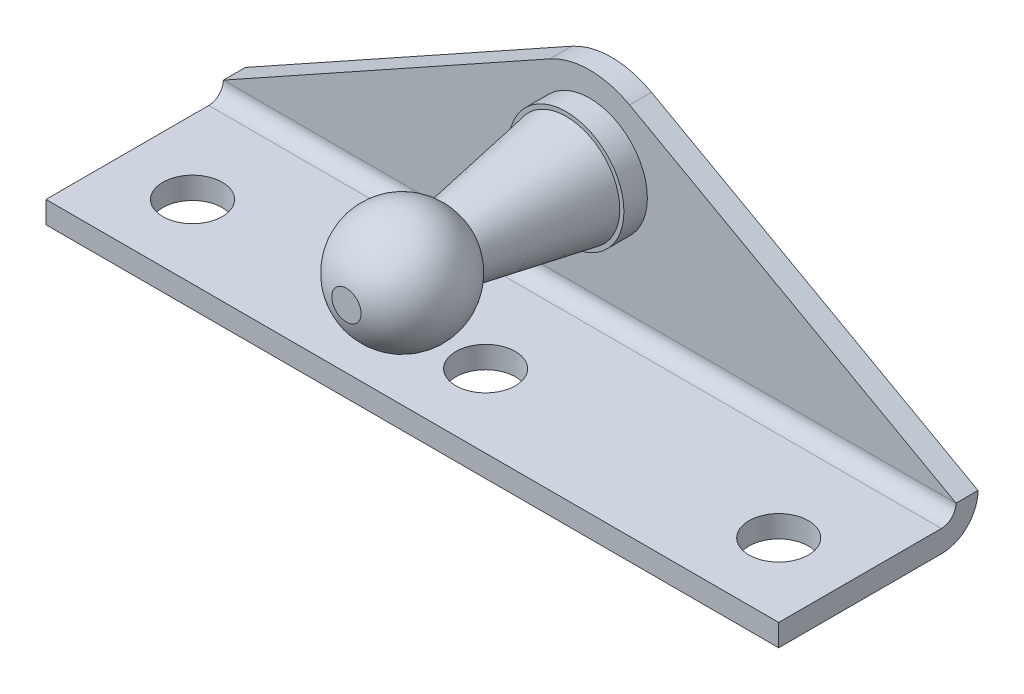
ISO-10303-21;
HEADER;
FILE_DESCRIPTION(('STEP AP214'),'2;1');
FILE_NAME('part.step','',(''),(''),'','','');
FILE_SCHEMA(('AUTOMOTIVE_DESIGN { 1 0 10303 214 1 1 1 1 }'));
ENDSEC;
DATA;
#1=APPLICATION_CONTEXT('core data for automotive mechanical design processes');
#2=APPLICATION_PROTOCOL_DEFINITION('international standard','automotive_design',2000,#1);
#3=PRODUCT_CONTEXT('',#1,'mechanical');
#4=PRODUCT('Part','Part','',(#3));
#5=PRODUCT_RELATED_PRODUCT_CATEGORY('part','',(#4));
#6=PRODUCT_DEFINITION_FORMATION('','',#4);
#7=PRODUCT_DEFINITION_CONTEXT('part definition',#1,'design');
#8=PRODUCT_DEFINITION('design','',#6,#7);
#9=PRODUCT_DEFINITION_SHAPE('','',#8);
#10=(LENGTH_UNIT() NAMED_UNIT(*) SI_UNIT(.MILLI.,.METRE.));
#11=(NAMED_UNIT(*) PLANE_ANGLE_UNIT() SI_UNIT($,.RADIAN.));
#12=(NAMED_UNIT(*) SI_UNIT($,.STERADIAN.) SOLID_ANGLE_UNIT());
#13=UNCERTAINTY_MEASURE_WITH_UNIT(LENGTH_MEASURE(1.E-05),#10,'distance_accuracy_value','');
#14=(GEOMETRIC_REPRESENTATION_CONTEXT(3) GLOBAL_UNCERTAINTY_ASSIGNED_CONTEXT((#13)) GLOBAL_UNIT_ASSIGNED_CONTEXT((#10,
#11,#12)) REPRESENTATION_CONTEXT('',''));
#15=CARTESIAN_POINT('',(0.,0.,0.));
#16=DIRECTION('',(0.,0.,1.));
#17=DIRECTION('',(1.,0.,0.));
#18=AXIS2_PLACEMENT_3D('',#15,#16,#17);
#19=CARTESIAN_POINT('',(0.,0.,1.905));
#20=DIRECTION('',(0.,0.,1.));
#21=DIRECTION('',(1.,0.,0.));
#22=AXIS2_PLACEMENT_3D('',#19,#20,#21);
#23=PLANE('',#22);
#24=DIRECTION('',(-0.873869365108266,-0.48616080953248,0.));
#25=VECTOR('',#24,1.);
#26=CARTESIAN_POINT('',(-3.457575677395,6.21495892464998,1.905));
#27=LINE('',#26,#25);
#28=CARTESIAN_POINT('',(-3.457575677395,6.21495892464998,1.905));
#29=VERTEX_POINT('',#28);
#30=CARTESIAN_POINT('',(-31.75,-9.525,1.905));
#31=VERTEX_POINT('',#30);
#32=EDGE_CURVE('E137',#29,#31,#27,.T.);
#33=ORIENTED_EDGE('',*,*,#32,.T.);
#34=DIRECTION('',(1.,0.,0.));
#35=VECTOR('',#34,1.);
#36=CARTESIAN_POINT('',(0.,-9.525,1.905));
#37=LINE('',#36,#35);
#38=CARTESIAN_POINT('',(31.75,-9.52499999999999,1.905));
#39=VERTEX_POINT('',#38);
#40=EDGE_CURVE('E160',#31,#39,#37,.T.);
#41=ORIENTED_EDGE('',*,*,#40,.T.);
#42=DIRECTION('',(-0.873869365108266,0.48616080953248,0.));
#43=VECTOR('',#42,1.);
#44=CARTESIAN_POINT('',(31.75,-9.52499999999999,1.905));
#45=LINE('',#44,#43);
#46=CARTESIAN_POINT('',(3.457575677395,6.21495892464998,1.905));
#47=VERTEX_POINT('',#46);
#48=EDGE_CURVE('E132',#39,#47,#45,.T.);
#49=ORIENTED_EDGE('',*,*,#48,.T.);
#50=CARTESIAN_POINT('',(0.,0.,1.905));
#51=DIRECTION('',(0.,0.,1.));
#52=DIRECTION('',(1.,0.,0.));
#53=AXIS2_PLACEMENT_3D('',#50,#51,#52);
#54=CIRCLE('',#53,7.112);
#55=EDGE_CURVE('E134',#47,#29,#54,.T.);
#56=ORIENTED_EDGE('',*,*,#55,.T.);
#57=EDGE_LOOP('',(#33,#41,#49,#56));
#58=FACE_BOUND('',#57,.T.);
#59=CARTESIAN_POINT('',(0.,0.,1.905));
#60=DIRECTION('',(0.,0.,1.));
#61=DIRECTION('',(1.,0.,0.));
#62=AXIS2_PLACEMENT_3D('',#59,#60,#61);
#63=CIRCLE('',#62,5.);
#64=CARTESIAN_POINT('',(5.,0.,1.905));
#65=VERTEX_POINT('',#64);
#66=EDGE_CURVE('E407',#65,#65,#63,.T.);
#67=ORIENTED_EDGE('',*,*,#66,.F.);
#68=EDGE_LOOP('',(#67));
#69=FACE_BOUND('',#68,.T.);
#70=ADVANCED_FACE('F33',(#58,#69),#23,.T.);
#71=CARTESIAN_POINT('',(-31.75,-9.525,1.905));
#72=DIRECTION('',(1.,0.,0.));
#73=DIRECTION('',(0.,0.,-1.));
#74=AXIS2_PLACEMENT_3D('',#71,#72,#73);
#75=PLANE('',#74);
#76=DIRECTION('',(0.,0.,-1.));
#77=VECTOR('',#76,1.);
#78=CARTESIAN_POINT('',(-31.75,-9.525,1.905));
#79=LINE('',#78,#77);
#80=CARTESIAN_POINT('',(-31.75,-9.525,0.));
#81=VERTEX_POINT('',#80);
#82=EDGE_CURVE('E140',#31,#81,#79,.T.);
#83=ORIENTED_EDGE('',*,*,#82,.T.);
#84=CARTESIAN_POINT('',(-31.75,-9.525,3.175));
#85=DIRECTION('',(1.,0.,0.));
#86=DIRECTION('',(0.,0.,-1.));
#87=AXIS2_PLACEMENT_3D('',#84,#85,#86);
#88=CIRCLE('',#87,3.175);
#89=CARTESIAN_POINT('',(-31.75,-12.7,3.175));
#90=VERTEX_POINT('',#89);
#91=EDGE_CURVE('E12',#81,#90,#88,.F.);
#92=ORIENTED_EDGE('',*,*,#91,.T.);
#93=DIRECTION('',(0.,0.,-1.));
#94=VECTOR('',#93,1.);
#95=CARTESIAN_POINT('',(-31.75,-12.7,1.905));
#96=LINE('',#95,#94);
#97=CARTESIAN_POINT('',(-31.75,-12.7,17.272));
#98=VERTEX_POINT('',#97);
#99=EDGE_CURVE('E158',#98,#90,#96,.T.);
#100=ORIENTED_EDGE('',*,*,#99,.F.);
#101=DIRECTION('',(0.,-1.,0.));
#102=VECTOR('',#101,1.);
#103=CARTESIAN_POINT('',(-31.75,-10.795,17.272));
#104=LINE('',#103,#102);
#105=CARTESIAN_POINT('',(-31.75,-10.795,17.272));
#106=VERTEX_POINT('',#105);
#107=EDGE_CURVE('E120',#106,#98,#104,.T.);
#108=ORIENTED_EDGE('',*,*,#107,.F.);
#109=DIRECTION('',(0.,0.,-1.));
#110=VECTOR('',#109,1.);
#111=CARTESIAN_POINT('',(-31.75,-10.795,17.272));
#112=LINE('',#111,#110);
#113=CARTESIAN_POINT('',(-31.75,-10.795,3.175));
#114=VERTEX_POINT('',#113);
#115=EDGE_CURVE('E112',#106,#114,#112,.T.);
#116=ORIENTED_EDGE('',*,*,#115,.T.);
#117=CARTESIAN_POINT('',(-31.75,-9.525,3.175));
#118=DIRECTION('',(1.,0.,0.));
#119=DIRECTION('',(0.,0.,-1.));
#120=AXIS2_PLACEMENT_3D('',#117,#118,#119);
#121=CIRCLE('',#120,1.27);
#122=EDGE_CURVE('E166',#114,#31,#121,.T.);
#123=ORIENTED_EDGE('',*,*,#122,.T.);
#124=EDGE_LOOP('',(#83,#92,#100,#108,#116,#123));
#125=FACE_BOUND('',#124,.T.);
#126=ADVANCED_FACE('F190',(#125),#75,.F.);
#127=CARTESIAN_POINT('',(-31.75,-12.7,1.905));
#128=DIRECTION('',(0.,1.,0.));
#129=DIRECTION('',(-1.,0.,0.));
#130=AXIS2_PLACEMENT_3D('',#127,#128,#129);
#131=PLANE('',#130);
#132=CARTESIAN_POINT('',(0.,-12.7,10.922));
#133=DIRECTION('',(0.,-1.,0.));
#134=DIRECTION('',(1.,0.,0.));
#135=AXIS2_PLACEMENT_3D('',#132,#133,#134);
#136=CIRCLE('',#135,2.5781);
#137=CARTESIAN_POINT('',(2.5781,-12.7,10.922));
#138=VERTEX_POINT('',#137);
#139=EDGE_CURVE('E186',#138,#138,#136,.T.);
#140=ORIENTED_EDGE('',*,*,#139,.F.);
#141=EDGE_LOOP('',(#140));
#142=FACE_BOUND('',#141,.T.);
#143=CARTESIAN_POINT('',(25.4,-12.7,10.922));
#144=DIRECTION('',(0.,-1.,0.));
#145=DIRECTION('',(1.,0.,0.));
#146=AXIS2_PLACEMENT_3D('',#143,#144,#145);
#147=CIRCLE('',#146,2.5781);
#148=CARTESIAN_POINT('',(27.9781,-12.7,10.922));
#149=VERTEX_POINT('',#148);
#150=EDGE_CURVE('E176',#149,#149,#147,.T.);
#151=ORIENTED_EDGE('',*,*,#150,.F.);
#152=EDGE_LOOP('',(#151));
#153=FACE_BOUND('',#152,.T.);
#154=CARTESIAN_POINT('',(-25.4,-12.7,10.922));
#155=DIRECTION('',(0.,-1.,0.));
#156=DIRECTION('',(1.,0.,0.));
#157=AXIS2_PLACEMENT_3D('',#154,#155,#156);
#158=CIRCLE('',#157,2.5781);
#159=CARTESIAN_POINT('',(-22.8219,-12.7,10.922));
#160=VERTEX_POINT('',#159);
#161=EDGE_CURVE('E173',#160,#160,#158,.T.);
#162=ORIENTED_EDGE('',*,*,#161,.F.);
#163=EDGE_LOOP('',(#162));
#164=FACE_BOUND('',#163,.T.);
#165=ORIENTED_EDGE('',*,*,#99,.T.);
#166=DIRECTION('',(1.,0.,0.));
#167=VECTOR('',#166,1.);
#168=CARTESIAN_POINT('',(-31.75,-12.7,3.175));
#169=LINE('',#168,#167);
#170=CARTESIAN_POINT('',(31.75,-12.7,3.175));
#171=VERTEX_POINT('',#170);
#172=EDGE_CURVE('E168',#90,#171,#169,.T.);
#173=ORIENTED_EDGE('',*,*,#172,.T.);
#174=DIRECTION('',(0.,0.,-1.));
#175=VECTOR('',#174,1.);
#176=CARTESIAN_POINT('',(31.75,-12.7,1.905));
#177=LINE('',#176,#175);
#178=CARTESIAN_POINT('',(31.75,-12.7,17.272));
#179=VERTEX_POINT('',#178);
#180=EDGE_CURVE('E156',#179,#171,#177,.T.);
#181=ORIENTED_EDGE('',*,*,#180,.F.);
#182=DIRECTION('',(-1.,0.,0.));
#183=VECTOR('',#182,1.);
#184=CARTESIAN_POINT('',(-31.75,-12.7,17.272));
#185=LINE('',#184,#183);
#186=EDGE_CURVE('E119',#179,#98,#185,.T.);
#187=ORIENTED_EDGE('',*,*,#186,.T.);
#188=EDGE_LOOP('',(#165,#173,#181,#187));
#189=FACE_BOUND('',#188,.T.);
#190=ADVANCED_FACE('F212',(#142,#153,#164,#189),#131,.F.);
#191=CARTESIAN_POINT('',(31.75,-12.7,1.905));
#192=DIRECTION('',(-1.,0.,0.));
#193=DIRECTION('',(0.,0.,1.));
#194=AXIS2_PLACEMENT_3D('',#191,#192,#193);
#195=PLANE('',#194);
#196=ORIENTED_EDGE('',*,*,#180,.T.);
#197=CARTESIAN_POINT('',(31.75,-9.52499999999999,3.175));
#198=DIRECTION('',(-1.,0.,0.));
#199=DIRECTION('',(0.,0.,1.));
#200=AXIS2_PLACEMENT_3D('',#197,#198,#199);
#201=CIRCLE('',#200,3.175);
#202=CARTESIAN_POINT('',(31.75,-9.52499999999999,0.));
#203=VERTEX_POINT('',#202);
#204=EDGE_CURVE('E56',#171,#203,#201,.F.);
#205=ORIENTED_EDGE('',*,*,#204,.T.);
#206=DIRECTION('',(0.,0.,-1.));
#207=VECTOR('',#206,1.);
#208=CARTESIAN_POINT('',(31.75,-9.52499999999999,1.905));
#209=LINE('',#208,#207);
#210=EDGE_CURVE('E153',#39,#203,#209,.T.);
#211=ORIENTED_EDGE('',*,*,#210,.F.);
#212=CARTESIAN_POINT('',(31.75,-9.52499999999999,3.175));
#213=DIRECTION('',(-1.,0.,0.));
#214=DIRECTION('',(0.,0.,1.));
#215=AXIS2_PLACEMENT_3D('',#212,#213,#214);
#216=CIRCLE('',#215,1.27);
#217=CARTESIAN_POINT('',(31.75,-10.795,3.175));
#218=VERTEX_POINT('',#217);
#219=EDGE_CURVE('E107',#39,#218,#216,.T.);
#220=ORIENTED_EDGE('',*,*,#219,.T.);
#221=DIRECTION('',(0.,0.,1.));
#222=VECTOR('',#221,1.);
#223=CARTESIAN_POINT('',(31.75,-10.795,17.272));
#224=LINE('',#223,#222);
#225=CARTESIAN_POINT('',(31.75,-10.795,17.272));
#226=VERTEX_POINT('',#225);
#227=EDGE_CURVE('E100',#218,#226,#224,.T.);
#228=ORIENTED_EDGE('',*,*,#227,.T.);
#229=DIRECTION('',(0.,-1.,0.));
#230=VECTOR('',#229,1.);
#231=CARTESIAN_POINT('',(31.75,-10.795,17.272));
#232=LINE('',#231,#230);
#233=EDGE_CURVE('E104',#226,#179,#232,.T.);
#234=ORIENTED_EDGE('',*,*,#233,.T.);
#235=EDGE_LOOP('',(#196,#205,#211,#220,#228,#234));
#236=FACE_BOUND('',#235,.T.);
#237=ADVANCED_FACE('F103',(#236),#195,.F.);
#238=CARTESIAN_POINT('',(31.75,-9.52499999999999,1.905));
#239=DIRECTION('',(-0.486160809532479,-0.873869365108266,0.));
#240=DIRECTION('',(0.873869365108266,-0.48616080953248,0.));
#241=AXIS2_PLACEMENT_3D('',#238,#239,#240);
#242=PLANE('',#241);
#243=DIRECTION('',(-0.873869365108266,0.48616080953248,0.));
#244=VECTOR('',#243,1.);
#245=CARTESIAN_POINT('',(31.75,-9.52499999999999,0.));
#246=LINE('',#245,#244);
#247=CARTESIAN_POINT('',(3.457575677395,6.21495892464998,0.));
#248=VERTEX_POINT('',#247);
#249=EDGE_CURVE('E130',#203,#248,#246,.T.);
#250=ORIENTED_EDGE('',*,*,#249,.T.);
#251=DIRECTION('',(0.,0.,-1.));
#252=VECTOR('',#251,1.);
#253=CARTESIAN_POINT('',(3.457575677395,6.21495892464998,1.905));
#254=LINE('',#253,#252);
#255=EDGE_CURVE('E150',#47,#248,#254,.T.);
#256=ORIENTED_EDGE('',*,*,#255,.F.);
#257=ORIENTED_EDGE('',*,*,#48,.F.);
#258=ORIENTED_EDGE('',*,*,#210,.T.);
#259=EDGE_LOOP('',(#250,#256,#257,#258));
#260=FACE_BOUND('',#259,.T.);
#261=ADVANCED_FACE('F202',(#260),#242,.F.);
#262=CARTESIAN_POINT('',(0.,0.,1.905));
#263=DIRECTION('',(0.,0.,-1.));
#264=DIRECTION('',(-1.,0.,0.));
#265=AXIS2_PLACEMENT_3D('',#262,#263,#264);
#266=CYLINDRICAL_SURFACE('',#265,7.112);
#267=CARTESIAN_POINT('',(0.,0.,0.));
#268=DIRECTION('',(0.,0.,1.));
#269=DIRECTION('',(1.,0.,0.));
#270=AXIS2_PLACEMENT_3D('',#267,#268,#269);
#271=CIRCLE('',#270,7.112);
#272=CARTESIAN_POINT('',(-3.457575677395,6.21495892464998,0.));
#273=VERTEX_POINT('',#272);
#274=EDGE_CURVE('E142',#248,#273,#271,.T.);
#275=ORIENTED_EDGE('',*,*,#274,.T.);
#276=DIRECTION('',(0.,0.,-1.));
#277=VECTOR('',#276,1.);
#278=CARTESIAN_POINT('',(-3.457575677395,6.21495892464998,1.905));
#279=LINE('',#278,#277);
#280=EDGE_CURVE('E147',#29,#273,#279,.T.);
#281=ORIENTED_EDGE('',*,*,#280,.F.);
#282=ORIENTED_EDGE('',*,*,#55,.F.);
#283=ORIENTED_EDGE('',*,*,#255,.T.);
#284=EDGE_LOOP('',(#275,#281,#282,#283));
#285=FACE_BOUND('',#284,.T.);
#286=ADVANCED_FACE('F207',(#285),#266,.T.);
#287=CARTESIAN_POINT('',(-3.457575677395,6.21495892464998,1.905));
#288=DIRECTION('',(0.48616080953248,-0.873869365108266,0.));
#289=DIRECTION('',(0.873869365108266,0.48616080953248,0.));
#290=AXIS2_PLACEMENT_3D('',#287,#288,#289);
#291=PLANE('',#290);
#292=DIRECTION('',(-0.873869365108266,-0.48616080953248,0.));
#293=VECTOR('',#292,1.);
#294=CARTESIAN_POINT('',(-3.457575677395,6.21495892464998,0.));
#295=LINE('',#294,#293);
#296=EDGE_CURVE('E135',#273,#81,#295,.T.);
#297=ORIENTED_EDGE('',*,*,#296,.T.);
#298=ORIENTED_EDGE('',*,*,#82,.F.);
#299=ORIENTED_EDGE('',*,*,#32,.F.);
#300=ORIENTED_EDGE('',*,*,#280,.T.);
#301=EDGE_LOOP('',(#297,#298,#299,#300));
#302=FACE_BOUND('',#301,.T.);
#303=ADVANCED_FACE('F210',(#302),#291,.F.);
#304=CARTESIAN_POINT('',(0.,0.,0.));
#305=DIRECTION('',(0.,0.,1.));
#306=DIRECTION('',(1.,0.,0.));
#307=AXIS2_PLACEMENT_3D('',#304,#305,#306);
#308=PLANE('',#307);
#309=ORIENTED_EDGE('',*,*,#249,.F.);
#310=DIRECTION('',(1.,0.,0.));
#311=VECTOR('',#310,1.);
#312=CARTESIAN_POINT('',(0.,-9.525,0.));
#313=LINE('',#312,#311);
#314=EDGE_CURVE('E42',#203,#81,#313,.F.);
#315=ORIENTED_EDGE('',*,*,#314,.T.);
#316=ORIENTED_EDGE('',*,*,#296,.F.);
#317=ORIENTED_EDGE('',*,*,#274,.F.);
#318=EDGE_LOOP('',(#309,#315,#316,#317));
#319=FACE_BOUND('',#318,.T.);
#320=ADVANCED_FACE('F231',(#319),#308,.F.);
#321=CARTESIAN_POINT('',(-31.75,-10.795,17.272));
#322=DIRECTION('',(0.,0.,1.));
#323=DIRECTION('',(1.,0.,0.));
#324=AXIS2_PLACEMENT_3D('',#321,#322,#323);
#325=PLANE('',#324);
#326=ORIENTED_EDGE('',*,*,#186,.F.);
#327=ORIENTED_EDGE('',*,*,#233,.F.);
#328=DIRECTION('',(-1.,0.,0.));
#329=VECTOR('',#328,1.);
#330=CARTESIAN_POINT('',(-31.75,-10.795,17.272));
#331=LINE('',#330,#329);
#332=EDGE_CURVE('E111',#226,#106,#331,.T.);
#333=ORIENTED_EDGE('',*,*,#332,.T.);
#334=ORIENTED_EDGE('',*,*,#107,.T.);
#335=EDGE_LOOP('',(#326,#327,#333,#334));
#336=FACE_BOUND('',#335,.T.);
#337=ADVANCED_FACE('F116',(#336),#325,.T.);
#338=CARTESIAN_POINT('',(-31.75,-10.795,0.));
#339=DIRECTION('',(0.,-1.,0.));
#340=DIRECTION('',(1.,0.,0.));
#341=AXIS2_PLACEMENT_3D('',#338,#339,#340);
#342=PLANE('',#341);
#343=CARTESIAN_POINT('',(0.,-10.795,10.922));
#344=DIRECTION('',(0.,-1.,0.));
#345=DIRECTION('',(1.,0.,0.));
#346=AXIS2_PLACEMENT_3D('',#343,#344,#345);
#347=CIRCLE('',#346,2.5781);
#348=CARTESIAN_POINT('',(2.5781,-10.795,10.922));
#349=VERTEX_POINT('',#348);
#350=EDGE_CURVE('E37',#349,#349,#347,.T.);
#351=ORIENTED_EDGE('',*,*,#350,.T.);
#352=EDGE_LOOP('',(#351));
#353=FACE_BOUND('',#352,.T.);
#354=CARTESIAN_POINT('',(25.4,-10.795,10.922));
#355=DIRECTION('',(0.,-1.,0.));
#356=DIRECTION('',(1.,0.,0.));
#357=AXIS2_PLACEMENT_3D('',#354,#355,#356);
#358=CIRCLE('',#357,2.5781);
#359=CARTESIAN_POINT('',(27.9781,-10.795,10.922));
#360=VERTEX_POINT('',#359);
#361=EDGE_CURVE('E174',#360,#360,#358,.T.);
#362=ORIENTED_EDGE('',*,*,#361,.T.);
#363=EDGE_LOOP('',(#362));
#364=FACE_BOUND('',#363,.T.);
#365=CARTESIAN_POINT('',(-25.4,-10.795,10.922));
#366=DIRECTION('',(0.,-1.,0.));
#367=DIRECTION('',(1.,0.,0.));
#368=AXIS2_PLACEMENT_3D('',#365,#366,#367);
#369=CIRCLE('',#368,2.5781);
#370=CARTESIAN_POINT('',(-22.8219,-10.795,10.922));
#371=VERTEX_POINT('',#370);
#372=EDGE_CURVE('E129',#371,#371,#369,.T.);
#373=ORIENTED_EDGE('',*,*,#372,.T.);
#374=EDGE_LOOP('',(#373));
#375=FACE_BOUND('',#374,.T.);
#376=ORIENTED_EDGE('',*,*,#227,.F.);
#377=DIRECTION('',(1.,0.,0.));
#378=VECTOR('',#377,1.);
#379=CARTESIAN_POINT('',(-31.75,-10.795,3.175));
#380=LINE('',#379,#378);
#381=EDGE_CURVE('E163',#218,#114,#380,.F.);
#382=ORIENTED_EDGE('',*,*,#381,.T.);
#383=ORIENTED_EDGE('',*,*,#115,.F.);
#384=ORIENTED_EDGE('',*,*,#332,.F.);
#385=EDGE_LOOP('',(#376,#382,#383,#384));
#386=FACE_BOUND('',#385,.T.);
#387=ADVANCED_FACE('F123',(#353,#364,#375,#386),#342,.F.);
#388=CARTESIAN_POINT('',(0.,-9.525,3.175));
#389=DIRECTION('',(1.,0.,0.));
#390=DIRECTION('',(0.,1.,0.));
#391=AXIS2_PLACEMENT_3D('',#388,#389,#390);
#392=CYLINDRICAL_SURFACE('',#391,1.27);
#393=ORIENTED_EDGE('',*,*,#122,.F.);
#394=ORIENTED_EDGE('',*,*,#381,.F.);
#395=ORIENTED_EDGE('',*,*,#219,.F.);
#396=ORIENTED_EDGE('',*,*,#40,.F.);
#397=EDGE_LOOP('',(#393,#394,#395,#396));
#398=FACE_BOUND('',#397,.T.);
#399=ADVANCED_FACE('F193',(#398),#392,.F.);
#400=CARTESIAN_POINT('',(-31.75,-9.525,3.175));
#401=DIRECTION('',(1.,0.,0.));
#402=DIRECTION('',(0.,1.,0.));
#403=AXIS2_PLACEMENT_3D('',#400,#401,#402);
#404=CYLINDRICAL_SURFACE('',#403,3.175);
#405=ORIENTED_EDGE('',*,*,#91,.F.);
#406=ORIENTED_EDGE('',*,*,#314,.F.);
#407=ORIENTED_EDGE('',*,*,#204,.F.);
#408=ORIENTED_EDGE('',*,*,#172,.F.);
#409=EDGE_LOOP('',(#405,#406,#407,#408));
#410=FACE_BOUND('',#409,.T.);
#411=ADVANCED_FACE('F35',(#410),#404,.T.);
#412=CARTESIAN_POINT('',(-25.4,7.112,10.922));
#413=DIRECTION('',(0.,-1.,0.));
#414=DIRECTION('',(1.,0.,0.));
#415=AXIS2_PLACEMENT_3D('',#412,#413,#414);
#416=CYLINDRICAL_SURFACE('',#415,2.5781);
#417=ORIENTED_EDGE('',*,*,#161,.T.);
#418=EDGE_LOOP('',(#417));
#419=FACE_BOUND('',#418,.T.);
#420=ORIENTED_EDGE('',*,*,#372,.F.);
#421=EDGE_LOOP('',(#420));
#422=FACE_BOUND('',#421,.T.);
#423=ADVANCED_FACE('F280',(#419,#422),#416,.F.);
#424=CARTESIAN_POINT('',(25.4,7.112,10.922));
#425=DIRECTION('',(0.,-1.,0.));
#426=DIRECTION('',(1.,0.,0.));
#427=AXIS2_PLACEMENT_3D('',#424,#425,#426);
#428=CYLINDRICAL_SURFACE('',#427,2.5781);
#429=ORIENTED_EDGE('',*,*,#150,.T.);
#430=EDGE_LOOP('',(#429));
#431=FACE_BOUND('',#430,.T.);
#432=ORIENTED_EDGE('',*,*,#361,.F.);
#433=EDGE_LOOP('',(#432));
#434=FACE_BOUND('',#433,.T.);
#435=ADVANCED_FACE('F285',(#431,#434),#428,.F.);
#436=CARTESIAN_POINT('',(0.,7.112,10.922));
#437=DIRECTION('',(0.,-1.,0.));
#438=DIRECTION('',(1.,0.,0.));
#439=AXIS2_PLACEMENT_3D('',#436,#437,#438);
#440=CYLINDRICAL_SURFACE('',#439,2.5781);
#441=ORIENTED_EDGE('',*,*,#139,.T.);
#442=EDGE_LOOP('',(#441));
#443=FACE_BOUND('',#442,.T.);
#444=ORIENTED_EDGE('',*,*,#350,.F.);
#445=EDGE_LOOP('',(#444));
#446=FACE_BOUND('',#445,.T.);
#447=ADVANCED_FACE('F293',(#443,#446),#440,.F.);
#448=CARTESIAN_POINT('',(0.,0.,22.987));
#449=DIRECTION('',(0.,0.,-1.));
#450=DIRECTION('',(-1.,0.,0.));
#451=AXIS2_PLACEMENT_3D('',#448,#449,#450);
#452=PLANE('',#451);
#453=CARTESIAN_POINT('',(0.,0.,22.987));
#454=DIRECTION('',(0.,0.,1.));
#455=DIRECTION('',(1.,0.,0.));
#456=AXIS2_PLACEMENT_3D('',#453,#454,#455);
#457=CIRCLE('',#456,1.27);
#458=CARTESIAN_POINT('',(1.27,0.,22.987));
#459=VERTEX_POINT('',#458);
#460=EDGE_CURVE('E416',#459,#459,#457,.T.);
#461=ORIENTED_EDGE('',*,*,#460,.T.);
#462=EDGE_LOOP('',(#461));
#463=FACE_BOUND('',#462,.T.);
#464=ADVANCED_FACE('F300',(#463),#452,.F.);
#465=CARTESIAN_POINT('',(0.,0.,18.1509789082346));
#466=DIRECTION('',(0.,0.,1.));
#467=DIRECTION('',(1.,0.,0.));
#468=AXIS2_PLACEMENT_3D('',#465,#466,#467);
#469=SPHERICAL_SURFACE('',#468,5.);
#470=CARTESIAN_POINT('',(0.,0.,14.044294139404));
#471=DIRECTION('',(0.,0.,1.));
#472=DIRECTION('',(1.,0.,0.));
#473=AXIS2_PLACEMENT_3D('',#470,#471,#472);
#474=CIRCLE('',#473,2.85221671852875);
#475=CARTESIAN_POINT('',(2.85221671852875,0.,14.044294139404));
#476=VERTEX_POINT('',#475);
#477=EDGE_CURVE('E414',#476,#476,#474,.T.);
#478=CARTESIAN_POINT('',(1.27,0.,22.987));
#479=CARTESIAN_POINT('',(1.38474378185201,0.,22.9568747610543));
#480=CARTESIAN_POINT('',(1.49841042088082,0.,22.9226516055055));
#481=CARTESIAN_POINT('',(1.72302462757044,0.,22.846214694128));
#482=CARTESIAN_POINT('',(1.83397219523124,0.,22.8040009382993));
#483=CARTESIAN_POINT('',(2.0525834734632,0.,22.7117880592877));
#484=CARTESIAN_POINT('',(2.16024718403436,0.,22.661788936105));
#485=CARTESIAN_POINT('',(2.37174628265786,0.,22.5542608261464));
#486=CARTESIAN_POINT('',(2.47558167071021,0.,22.4967318393705));
#487=CARTESIAN_POINT('',(2.6788980581146,0.,22.3744347343372));
#488=CARTESIAN_POINT('',(2.77837905746664,0.,22.3096666160797));
#489=CARTESIAN_POINT('',(2.97248291828595,0.,22.173219420087));
#490=CARTESIAN_POINT('',(3.06710577975322,0.,22.1015403423517));
#491=CARTESIAN_POINT('',(3.25101414787636,0.,21.9516341902266));
#492=CARTESIAN_POINT('',(3.34029965453225,0.,21.8734071158368));
#493=CARTESIAN_POINT('',(3.51308114528181,0.,21.7108011503724));
#494=CARTESIAN_POINT('',(3.5965771293755,0.,21.6264222592978));
#495=CARTESIAN_POINT('',(3.75735672223874,0.,21.451939980321));
#496=CARTESIAN_POINT('',(3.8346403310083,0.,21.3618365924188));
#497=CARTESIAN_POINT('',(3.98260378338047,0.,21.1763616344302));
#498=CARTESIAN_POINT('',(4.05328362698307,0.,21.0809900643437));
#499=CARTESIAN_POINT('',(4.18768160249565,0.,20.8854617353973));
#500=CARTESIAN_POINT('',(4.25139973440562,0.,20.7853049765372));
#501=CARTESIAN_POINT('',(4.37155159654966,0.,20.5807134975442));
#502=CARTESIAN_POINT('',(4.42798532678373,0.,20.4762787774113));
#503=CARTESIAN_POINT('',(4.5332825862212,0.,20.2636602683274));
#504=CARTESIAN_POINT('',(4.5821461154246,0.,20.1554764793765));
#505=CARTESIAN_POINT('',(4.67205551149158,0.,19.9359077116752));
#506=CARTESIAN_POINT('',(4.71310137835517,0.,19.8245227329248));
#507=CARTESIAN_POINT('',(4.78716757969723,0.,19.5991156765368));
#508=CARTESIAN_POINT('',(4.8201879141757,0.,19.4850935988993));
#509=CARTESIAN_POINT('',(4.87803582469211,0.,19.2549897908045));
#510=CARTESIAN_POINT('',(4.90286340073006,0.,19.1389080603474));
#511=CARTESIAN_POINT('',(4.94420005918813,0.,18.9052728234539));
#512=CARTESIAN_POINT('',(4.96070914160824,0.,18.7877193170175));
#513=CARTESIAN_POINT('',(4.98532520529685,0.,18.5517358585733));
#514=CARTESIAN_POINT('',(4.99343218656533,0.,18.4333059065654));
#515=CARTESIAN_POINT('',(5.00120299147658,0.,18.1961693260011));
#516=CARTESIAN_POINT('',(5.00086681511935,0.,18.0774626974445));
#517=CARTESIAN_POINT('',(4.99175300728984,0.,17.8403739339869));
#518=CARTESIAN_POINT('',(4.98297537581757,0.,17.7219917990859));
#519=CARTESIAN_POINT('',(4.95702311062665,0.,17.4861515498036));
#520=CARTESIAN_POINT('',(4.93984847690801,0.,17.3686934354223));
#521=CARTESIAN_POINT('',(4.89718918534418,0.,17.1352960744764));
#522=CARTESIAN_POINT('',(4.87170452749899,0.,17.0193568279119));
#523=CARTESIAN_POINT('',(4.81255425050177,0.,16.7895843579038));
#524=CARTESIAN_POINT('',(4.77888863134973,0.,16.6757511344602));
#525=CARTESIAN_POINT('',(4.70354692588307,0.,16.4507672001534));
#526=CARTESIAN_POINT('',(4.66187083956845,0.,16.3396164892902));
#527=CARTESIAN_POINT('',(4.57071926090229,0.,16.120560485344));
#528=CARTESIAN_POINT('',(4.52124376855075,0.,16.012655192261));
#529=CARTESIAN_POINT('',(4.41474394040569,0.,15.8006364898894));
#530=CARTESIAN_POINT('',(4.35771960461217,0.,15.6965230806009));
#531=CARTESIAN_POINT('',(4.23641087212898,0.,15.4926154207791));
#532=CARTESIAN_POINT('',(4.17212647543931,0.,15.392821170246));
#533=CARTESIAN_POINT('',(4.03662320813774,0.,15.1980571832518));
#534=CARTESIAN_POINT('',(3.96540433752585,0.,15.1030874467909));
#535=CARTESIAN_POINT('',(3.81639268960979,0.,14.9184535818797));
#536=CARTESIAN_POINT('',(3.73859991230564,0.,14.8287894534294));
#537=CARTESIAN_POINT('',(3.57683482665,0.,14.655220388753));
#538=CARTESIAN_POINT('',(3.49286251829852,0.,14.5713154525268));
#539=CARTESIAN_POINT('',(3.31916211587839,0.,14.4096915798319));
#540=CARTESIAN_POINT('',(3.22943402180973,0.,14.3319726433633));
#541=CARTESIAN_POINT('',(3.04468212870618,0.,14.1831073308744));
#542=CARTESIAN_POINT('',(2.94965832967129,0.,14.1119609548543));
#543=CARTESIAN_POINT('',(2.85221671852875,0.,14.044294139404));
#544=B_SPLINE_CURVE_WITH_KNOTS('',3,(#478,#479,#480,#481,#482,#483,#484,#485,#486,#487,#488,
#489,#490,#491,#492,#493,#494,#495,#496,#497,#498,#499,#500,#501,#502,#503,#504,#505,#506,#507,
#508,#509,#510,#511,#512,#513,#514,#515,#516,#517,#518,#519,#520,#521,#522,#523,#524,#525,#526,
#527,#528,#529,#530,#531,#532,#533,#534,#535,#536,#537,#538,#539,#540,#541,#542,#543),
.UNSPECIFIED.,.F.,.F.,(4,2,2,2,2,2,2,2,2,2,2,2,2,2,2,2,2,2,2,2,2,2,2,2,2,2,2,2,2,2,2,2,4),(0.,
0.355820727433009,0.711641454866017,1.06746218229903,1.42328290973203,1.77910363716504,
2.13492436459805,2.49074509203106,2.84656581946407,3.20238654689708,3.55820727433009,
3.91402800176309,4.2698487291961,4.62566945662911,4.98149018406212,5.33731091149513,
5.69313163892814,6.04895236636115,6.40477309379415,6.76059382122717,7.11641454866017,
7.47223527609318,7.82805600352619,8.1838767309592,8.53969745839221,8.89551818582522,
9.25133891325822,9.60715964069123,9.96298036812424,10.3188010955572,10.6746218229903,
11.0304425504233,11.3862632778563),.UNSPECIFIED.);
#545=EDGE_CURVE('BSEAM308',#459,#476,#544,.T.);
#546=ORIENTED_EDGE('',*,*,#460,.F.);
#547=ORIENTED_EDGE('',*,*,#477,.T.);
#548=ORIENTED_EDGE('',*,*,#545,.T.);
#549=ORIENTED_EDGE('',*,*,#545,.F.);
#550=EDGE_LOOP('',(#546,#548,#547,#549));
#551=FACE_BOUND('',#550,.T.);
#552=ADVANCED_FACE('F308',(#551),#469,.T.);
#553=CARTESIAN_POINT('',(0.,0.,3.937));
#554=DIRECTION('',(0.,0.,-1.));
#555=DIRECTION('',(-1.,0.,0.));
#556=AXIS2_PLACEMENT_3D('',#553,#554,#555);
#557=CONICAL_SURFACE('',#556,4.64048192771085,0.175115941132454);
#558=ORIENTED_EDGE('',*,*,#477,.F.);
#559=EDGE_LOOP('',(#558));
#560=FACE_BOUND('',#559,.T.);
#561=CARTESIAN_POINT('',(0.,0.,3.937));
#562=DIRECTION('',(0.,0.,1.));
#563=DIRECTION('',(1.,0.,0.));
#564=AXIS2_PLACEMENT_3D('',#561,#562,#563);
#565=CIRCLE('',#564,4.64048192771085);
#566=CARTESIAN_POINT('',(4.64048192771085,0.,3.937));
#567=VERTEX_POINT('',#566);
#568=EDGE_CURVE('E409',#567,#567,#565,.T.);
#569=ORIENTED_EDGE('',*,*,#568,.T.);
#570=EDGE_LOOP('',(#569));
#571=FACE_BOUND('',#570,.T.);
#572=ADVANCED_FACE('F316',(#560,#571),#557,.T.);
#573=CARTESIAN_POINT('',(4.64048192771085,0.,3.937));
#574=DIRECTION('',(0.,0.,-1.));
#575=DIRECTION('',(-1.,0.,0.));
#576=AXIS2_PLACEMENT_3D('',#573,#574,#575);
#577=PLANE('',#576);
#578=ORIENTED_EDGE('',*,*,#568,.F.);
#579=EDGE_LOOP('',(#578));
#580=FACE_BOUND('',#579,.T.);
#581=CARTESIAN_POINT('',(0.,0.,3.937));
#582=DIRECTION('',(0.,0.,1.));
#583=DIRECTION('',(1.,0.,0.));
#584=AXIS2_PLACEMENT_3D('',#581,#582,#583);
#585=CIRCLE('',#584,5.);
#586=CARTESIAN_POINT('',(5.,0.,3.937));
#587=VERTEX_POINT('',#586);
#588=EDGE_CURVE('E404',#587,#587,#585,.T.);
#589=ORIENTED_EDGE('',*,*,#588,.T.);
#590=EDGE_LOOP('',(#589));
#591=FACE_BOUND('',#590,.T.);
#592=ADVANCED_FACE('F324',(#580,#591),#577,.F.);
#593=CARTESIAN_POINT('',(0.,0.,1.905));
#594=DIRECTION('',(0.,0.,1.));
#595=DIRECTION('',(1.,0.,0.));
#596=AXIS2_PLACEMENT_3D('',#593,#594,#595);
#597=CYLINDRICAL_SURFACE('',#596,5.);
#598=ORIENTED_EDGE('',*,*,#588,.F.);
#599=EDGE_LOOP('',(#598));
#600=FACE_BOUND('',#599,.T.);
#601=ORIENTED_EDGE('',*,*,#66,.T.);
#602=EDGE_LOOP('',(#601));
#603=FACE_BOUND('',#602,.T.);
#604=ADVANCED_FACE('F332',(#600,#603),#597,.T.);
#605=CLOSED_SHELL('',(#70,#126,#190,#237,#261,#286,#303,#320,#337,#387,#399,#411,#423,#435,#447,
#464,#552,#572,#592,#604));
#606=MANIFOLD_SOLID_BREP('B2',#605);
#607=ADVANCED_BREP_SHAPE_REPRESENTATION('',(#18,#606),#14);
#608=SHAPE_DEFINITION_REPRESENTATION(#9,#607);
ENDSEC;
END-ISO-10303-21;
